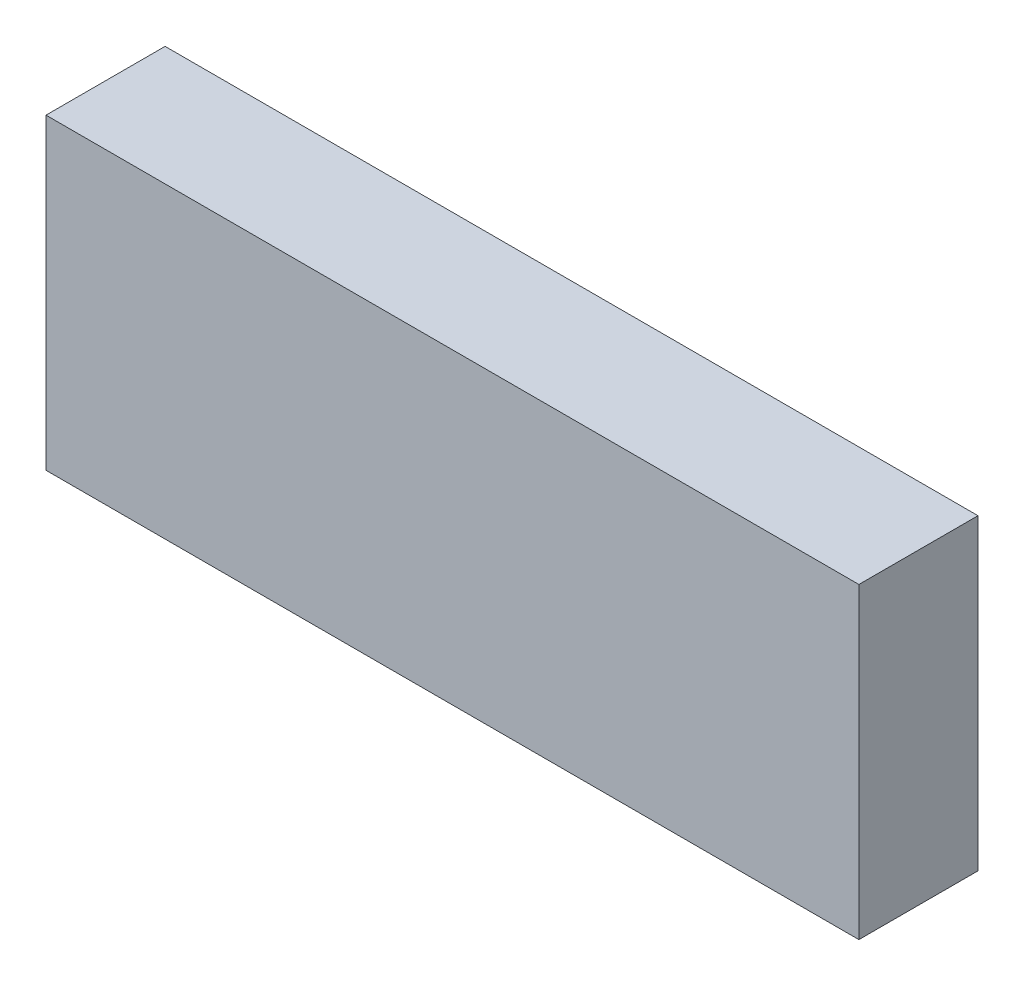
ISO-10303-21;
HEADER;
FILE_DESCRIPTION(('STEP AP214'),'2;1');
FILE_NAME('part.step','',(''),(''),'','','');
FILE_SCHEMA(('AUTOMOTIVE_DESIGN { 1 0 10303 214 1 1 1 1 }'));
ENDSEC;
DATA;
#1=APPLICATION_CONTEXT('core data for automotive mechanical design processes');
#2=APPLICATION_PROTOCOL_DEFINITION('international standard','automotive_design',2000,#1);
#3=PRODUCT_CONTEXT('',#1,'mechanical');
#4=PRODUCT('Part','Part','',(#3));
#5=PRODUCT_RELATED_PRODUCT_CATEGORY('part','',(#4));
#6=PRODUCT_DEFINITION_FORMATION('','',#4);
#7=PRODUCT_DEFINITION_CONTEXT('part definition',#1,'design');
#8=PRODUCT_DEFINITION('design','',#6,#7);
#9=PRODUCT_DEFINITION_SHAPE('','',#8);
#10=(LENGTH_UNIT() NAMED_UNIT(*) SI_UNIT(.MILLI.,.METRE.));
#11=(NAMED_UNIT(*) PLANE_ANGLE_UNIT() SI_UNIT($,.RADIAN.));
#12=(NAMED_UNIT(*) SI_UNIT($,.STERADIAN.) SOLID_ANGLE_UNIT());
#13=UNCERTAINTY_MEASURE_WITH_UNIT(LENGTH_MEASURE(1.E-05),#10,'distance_accuracy_value','');
#14=(GEOMETRIC_REPRESENTATION_CONTEXT(3) GLOBAL_UNCERTAINTY_ASSIGNED_CONTEXT((#13)) GLOBAL_UNIT_ASSIGNED_CONTEXT((#10,
#11,#12)) REPRESENTATION_CONTEXT('',''));
#15=CARTESIAN_POINT('',(0.,0.,0.));
#16=DIRECTION('',(0.,0.,1.));
#17=DIRECTION('',(1.,0.,0.));
#18=AXIS2_PLACEMENT_3D('',#15,#16,#17);
#19=CARTESIAN_POINT('',(0.,0.,10.16));
#20=DIRECTION('',(1.,0.,0.));
#21=DIRECTION('',(0.,0.,-1.));
#22=AXIS2_PLACEMENT_3D('',#19,#20,#21);
#23=PLANE('',#22);
#24=DIRECTION('',(0.,-1.,0.));
#25=VECTOR('',#24,1.);
#26=CARTESIAN_POINT('',(0.,0.,0.));
#27=LINE('',#26,#25);
#28=CARTESIAN_POINT('',(0.,26.2382,0.));
#29=VERTEX_POINT('',#28);
#30=CARTESIAN_POINT('',(0.,0.,0.));
#31=VERTEX_POINT('',#30);
#32=EDGE_CURVE('E111',#29,#31,#27,.T.);
#33=ORIENTED_EDGE('',*,*,#32,.T.);
#34=DIRECTION('',(0.,0.,-1.));
#35=VECTOR('',#34,1.);
#36=CARTESIAN_POINT('',(0.,0.,10.16));
#37=LINE('',#36,#35);
#38=CARTESIAN_POINT('',(0.,0.,10.16));
#39=VERTEX_POINT('',#38);
#40=EDGE_CURVE('E11',#39,#31,#37,.T.);
#41=ORIENTED_EDGE('',*,*,#40,.F.);
#42=DIRECTION('',(0.,-1.,0.));
#43=VECTOR('',#42,1.);
#44=CARTESIAN_POINT('',(0.,0.,10.16));
#45=LINE('',#44,#43);
#46=CARTESIAN_POINT('',(0.,26.2382,10.16));
#47=VERTEX_POINT('',#46);
#48=EDGE_CURVE('E95',#47,#39,#45,.T.);
#49=ORIENTED_EDGE('',*,*,#48,.F.);
#50=DIRECTION('',(0.,0.,-1.));
#51=VECTOR('',#50,1.);
#52=CARTESIAN_POINT('',(0.,26.2382,10.16));
#53=LINE('',#52,#51);
#54=EDGE_CURVE('E107',#47,#29,#53,.T.);
#55=ORIENTED_EDGE('',*,*,#54,.T.);
#56=EDGE_LOOP('',(#33,#41,#49,#55));
#57=FACE_BOUND('',#56,.T.);
#58=ADVANCED_FACE('F43',(#57),#23,.F.);
#59=CARTESIAN_POINT('',(0.,0.,10.16));
#60=DIRECTION('',(0.,1.,0.));
#61=DIRECTION('',(0.,0.,1.));
#62=AXIS2_PLACEMENT_3D('',#59,#60,#61);
#63=PLANE('',#62);
#64=DIRECTION('',(1.,0.,0.));
#65=VECTOR('',#64,1.);
#66=CARTESIAN_POINT('',(0.,0.,0.));
#67=LINE('',#66,#65);
#68=CARTESIAN_POINT('',(69.342,0.,0.));
#69=VERTEX_POINT('',#68);
#70=EDGE_CURVE('E100',#31,#69,#67,.T.);
#71=ORIENTED_EDGE('',*,*,#70,.T.);
#72=DIRECTION('',(0.,0.,-1.));
#73=VECTOR('',#72,1.);
#74=CARTESIAN_POINT('',(69.342,0.,10.16));
#75=LINE('',#74,#73);
#76=CARTESIAN_POINT('',(69.342,0.,10.16));
#77=VERTEX_POINT('',#76);
#78=EDGE_CURVE('E52',#77,#69,#75,.T.);
#79=ORIENTED_EDGE('',*,*,#78,.F.);
#80=DIRECTION('',(1.,0.,0.));
#81=VECTOR('',#80,1.);
#82=CARTESIAN_POINT('',(0.,0.,10.16));
#83=LINE('',#82,#81);
#84=EDGE_CURVE('E90',#39,#77,#83,.T.);
#85=ORIENTED_EDGE('',*,*,#84,.F.);
#86=ORIENTED_EDGE('',*,*,#40,.T.);
#87=EDGE_LOOP('',(#71,#79,#85,#86));
#88=FACE_BOUND('',#87,.T.);
#89=ADVANCED_FACE('F99',(#88),#63,.F.);
#90=CARTESIAN_POINT('',(69.342,0.,10.16));
#91=DIRECTION('',(-1.,0.,0.));
#92=DIRECTION('',(0.,0.,1.));
#93=AXIS2_PLACEMENT_3D('',#90,#91,#92);
#94=PLANE('',#93);
#95=DIRECTION('',(0.,1.,0.));
#96=VECTOR('',#95,1.);
#97=CARTESIAN_POINT('',(69.342,0.,0.));
#98=LINE('',#97,#96);
#99=CARTESIAN_POINT('',(69.342,26.2382,0.));
#100=VERTEX_POINT('',#99);
#101=EDGE_CURVE('E77',#69,#100,#98,.T.);
#102=ORIENTED_EDGE('',*,*,#101,.T.);
#103=DIRECTION('',(0.,0.,-1.));
#104=VECTOR('',#103,1.);
#105=CARTESIAN_POINT('',(69.342,26.2382,10.16));
#106=LINE('',#105,#104);
#107=CARTESIAN_POINT('',(69.342,26.2382,10.16));
#108=VERTEX_POINT('',#107);
#109=EDGE_CURVE('E102',#108,#100,#106,.T.);
#110=ORIENTED_EDGE('',*,*,#109,.F.);
#111=DIRECTION('',(0.,1.,0.));
#112=VECTOR('',#111,1.);
#113=CARTESIAN_POINT('',(69.342,0.,10.16));
#114=LINE('',#113,#112);
#115=EDGE_CURVE('E93',#77,#108,#114,.T.);
#116=ORIENTED_EDGE('',*,*,#115,.F.);
#117=ORIENTED_EDGE('',*,*,#78,.T.);
#118=EDGE_LOOP('',(#102,#110,#116,#117));
#119=FACE_BOUND('',#118,.T.);
#120=ADVANCED_FACE('F103',(#119),#94,.F.);
#121=CARTESIAN_POINT('',(0.,26.2382,10.16));
#122=DIRECTION('',(0.,-1.,0.));
#123=DIRECTION('',(0.,0.,-1.));
#124=AXIS2_PLACEMENT_3D('',#121,#122,#123);
#125=PLANE('',#124);
#126=DIRECTION('',(-1.,0.,0.));
#127=VECTOR('',#126,1.);
#128=CARTESIAN_POINT('',(0.,26.2382,0.));
#129=LINE('',#128,#127);
#130=EDGE_CURVE('E83',#100,#29,#129,.T.);
#131=ORIENTED_EDGE('',*,*,#130,.T.);
#132=ORIENTED_EDGE('',*,*,#54,.F.);
#133=DIRECTION('',(-1.,0.,0.));
#134=VECTOR('',#133,1.);
#135=CARTESIAN_POINT('',(0.,26.2382,10.16));
#136=LINE('',#135,#134);
#137=EDGE_CURVE('E60',#108,#47,#136,.T.);
#138=ORIENTED_EDGE('',*,*,#137,.F.);
#139=ORIENTED_EDGE('',*,*,#109,.T.);
#140=EDGE_LOOP('',(#131,#132,#138,#139));
#141=FACE_BOUND('',#140,.T.);
#142=ADVANCED_FACE('F124',(#141),#125,.F.);
#143=CARTESIAN_POINT('',(0.,0.,10.16));
#144=DIRECTION('',(0.,0.,-1.));
#145=DIRECTION('',(-1.,0.,0.));
#146=AXIS2_PLACEMENT_3D('',#143,#144,#145);
#147=PLANE('',#146);
#148=ORIENTED_EDGE('',*,*,#48,.T.);
#149=ORIENTED_EDGE('',*,*,#84,.T.);
#150=ORIENTED_EDGE('',*,*,#115,.T.);
#151=ORIENTED_EDGE('',*,*,#137,.T.);
#152=EDGE_LOOP('',(#148,#149,#150,#151));
#153=FACE_BOUND('',#152,.T.);
#154=ADVANCED_FACE('F91',(#153),#147,.F.);
#155=CARTESIAN_POINT('',(0.,0.,0.));
#156=DIRECTION('',(0.,0.,-1.));
#157=DIRECTION('',(-1.,0.,0.));
#158=AXIS2_PLACEMENT_3D('',#155,#156,#157);
#159=PLANE('',#158);
#160=ORIENTED_EDGE('',*,*,#32,.F.);
#161=ORIENTED_EDGE('',*,*,#130,.F.);
#162=ORIENTED_EDGE('',*,*,#101,.F.);
#163=ORIENTED_EDGE('',*,*,#70,.F.);
#164=EDGE_LOOP('',(#160,#161,#162,#163));
#165=FACE_BOUND('',#164,.T.);
#166=ADVANCED_FACE('F127',(#165),#159,.T.);
#167=CLOSED_SHELL('',(#58,#89,#120,#142,#154,#166));
#168=MANIFOLD_SOLID_BREP('B2',#167);
#169=ADVANCED_BREP_SHAPE_REPRESENTATION('',(#18,#168),#14);
#170=SHAPE_DEFINITION_REPRESENTATION(#9,#169);
ENDSEC;
END-ISO-10303-21;
